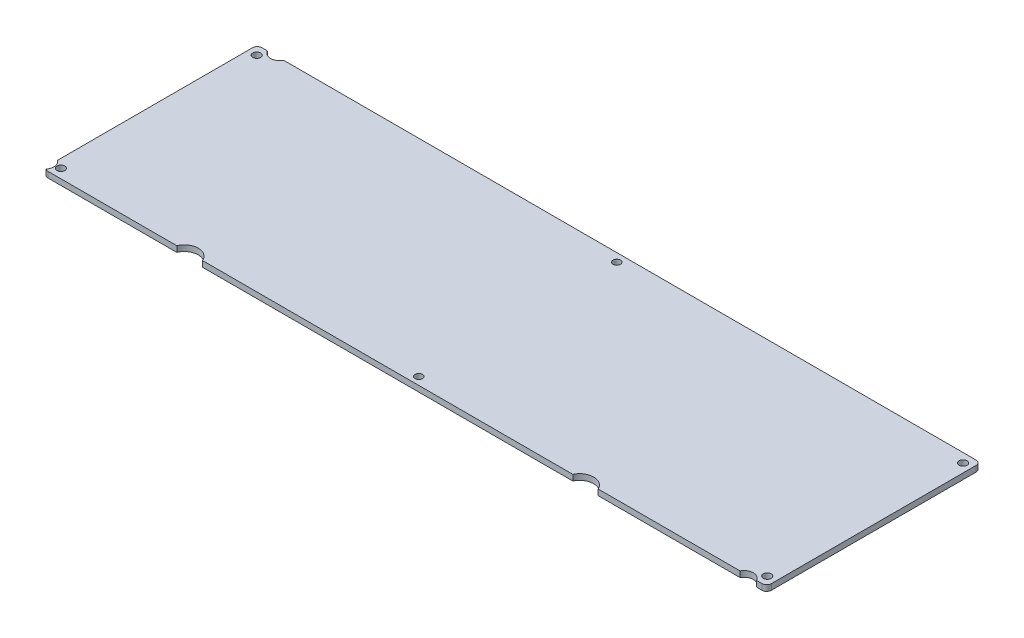
ISO-10303-21;
HEADER;
FILE_DESCRIPTION(('STEP AP214'),'2;1');
FILE_NAME('part.step','',(''),(''),'','','');
FILE_SCHEMA(('AUTOMOTIVE_DESIGN { 1 0 10303 214 1 1 1 1 }'));
ENDSEC;
DATA;
#1=APPLICATION_CONTEXT('core data for automotive mechanical design processes');
#2=APPLICATION_PROTOCOL_DEFINITION('international standard','automotive_design',2000,#1);
#3=PRODUCT_CONTEXT('',#1,'mechanical');
#4=PRODUCT('Part','Part','',(#3));
#5=PRODUCT_RELATED_PRODUCT_CATEGORY('part','',(#4));
#6=PRODUCT_DEFINITION_FORMATION('','',#4);
#7=PRODUCT_DEFINITION_CONTEXT('part definition',#1,'design');
#8=PRODUCT_DEFINITION('design','',#6,#7);
#9=PRODUCT_DEFINITION_SHAPE('','',#8);
#10=(LENGTH_UNIT() NAMED_UNIT(*) SI_UNIT(.MILLI.,.METRE.));
#11=(NAMED_UNIT(*) PLANE_ANGLE_UNIT() SI_UNIT($,.RADIAN.));
#12=(NAMED_UNIT(*) SI_UNIT($,.STERADIAN.) SOLID_ANGLE_UNIT());
#13=UNCERTAINTY_MEASURE_WITH_UNIT(LENGTH_MEASURE(1.E-05),#10,'distance_accuracy_value','');
#14=(GEOMETRIC_REPRESENTATION_CONTEXT(3) GLOBAL_UNCERTAINTY_ASSIGNED_CONTEXT((#13)) GLOBAL_UNIT_ASSIGNED_CONTEXT((#10,
#11,#12)) REPRESENTATION_CONTEXT('',''));
#15=CARTESIAN_POINT('',(0.,0.,0.));
#16=DIRECTION('',(0.,0.,1.));
#17=DIRECTION('',(1.,0.,0.));
#18=AXIS2_PLACEMENT_3D('',#15,#16,#17);
#19=CARTESIAN_POINT('',(0.,2.5,0.));
#20=DIRECTION('',(0.,0.,-1.));
#21=DIRECTION('',(-1.,0.,0.));
#22=AXIS2_PLACEMENT_3D('',#19,#20,#21);
#23=PLANE('',#22);
#24=DIRECTION('',(1.,0.,0.));
#25=VECTOR('',#24,1.);
#26=CARTESIAN_POINT('',(0.,0.,0.));
#27=LINE('',#26,#25);
#28=CARTESIAN_POINT('',(68.4803896985448,0.,0.));
#29=VERTEX_POINT('',#28);
#30=CARTESIAN_POINT('',(227.670515161693,0.,0.));
#31=VERTEX_POINT('',#30);
#32=EDGE_CURVE('E205',#29,#31,#27,.T.);
#33=ORIENTED_EDGE('',*,*,#32,.T.);
#34=DIRECTION('',(0.,1.,0.));
#35=VECTOR('',#34,1.);
#36=CARTESIAN_POINT('',(227.670515161693,0.,0.));
#37=LINE('',#36,#35);
#38=CARTESIAN_POINT('',(227.670515161693,2.5,0.));
#39=VERTEX_POINT('',#38);
#40=EDGE_CURVE('E11',#31,#39,#37,.T.);
#41=ORIENTED_EDGE('',*,*,#40,.T.);
#42=DIRECTION('',(1.,0.,0.));
#43=VECTOR('',#42,1.);
#44=CARTESIAN_POINT('',(0.,2.5,0.));
#45=LINE('',#44,#43);
#46=CARTESIAN_POINT('',(68.4803896985448,2.5,0.));
#47=VERTEX_POINT('',#46);
#48=EDGE_CURVE('E170',#47,#39,#45,.T.);
#49=ORIENTED_EDGE('',*,*,#48,.F.);
#50=DIRECTION('',(0.,1.,0.));
#51=VECTOR('',#50,1.);
#52=CARTESIAN_POINT('',(68.4803896985448,0.,0.));
#53=LINE('',#52,#51);
#54=EDGE_CURVE('E152',#47,#29,#53,.F.);
#55=ORIENTED_EDGE('',*,*,#54,.T.);
#56=EDGE_LOOP('',(#33,#41,#49,#55));
#57=FACE_BOUND('',#56,.T.);
#58=ADVANCED_FACE('F36',(#57),#23,.F.);
#59=CARTESIAN_POINT('',(2.,0.,0.));
#60=VERTEX_POINT('',#59);
#61=CARTESIAN_POINT('',(57.4042839011235,0.,0.));
#62=VERTEX_POINT('',#61);
#63=EDGE_CURVE('E201',#60,#62,#27,.T.);
#64=ORIENTED_EDGE('',*,*,#63,.T.);
#65=DIRECTION('',(0.,1.,0.));
#66=VECTOR('',#65,1.);
#67=CARTESIAN_POINT('',(57.4042839011235,0.,0.));
#68=LINE('',#67,#66);
#69=CARTESIAN_POINT('',(57.4042839011235,2.5,0.));
#70=VERTEX_POINT('',#69);
#71=EDGE_CURVE('E161',#62,#70,#68,.T.);
#72=ORIENTED_EDGE('',*,*,#71,.T.);
#73=CARTESIAN_POINT('',(2.,2.5,0.));
#74=VERTEX_POINT('',#73);
#75=EDGE_CURVE('E172',#74,#70,#45,.T.);
#76=ORIENTED_EDGE('',*,*,#75,.F.);
#77=DIRECTION('',(0.,-1.,0.));
#78=VECTOR('',#77,1.);
#79=CARTESIAN_POINT('',(2.,2.5,0.));
#80=LINE('',#79,#78);
#81=EDGE_CURVE('E258',#74,#60,#80,.T.);
#82=ORIENTED_EDGE('',*,*,#81,.T.);
#83=EDGE_LOOP('',(#64,#72,#76,#82));
#84=FACE_BOUND('',#83,.T.);
#85=ADVANCED_FACE('F281',(#84),#23,.F.);
#86=CARTESIAN_POINT('',(303.08,2.5,1.84499999999999));
#87=DIRECTION('',(0.,1.,0.));
#88=DIRECTION('',(0.,0.,1.));
#89=AXIS2_PLACEMENT_3D('',#86,#87,#88);
#90=PLANE('',#89);
#91=CARTESIAN_POINT('',(233.122222663393,2.5,2.50577040366954));
#92=DIRECTION('',(0.,1.,0.));
#93=DIRECTION('',(0.,0.,1.));
#94=AXIS2_PLACEMENT_3D('',#91,#92,#93);
#95=CIRCLE('',#94,6.00000000000002);
#96=CARTESIAN_POINT('',(238.573930165093,2.5,0.));
#97=VERTEX_POINT('',#96);
#98=EDGE_CURVE('E278',#97,#39,#95,.T.);
#99=ORIENTED_EDGE('',*,*,#98,.F.);
#100=CARTESIAN_POINT('',(299.530919133071,2.5,0.));
#101=VERTEX_POINT('',#100);
#102=EDGE_CURVE('E174',#97,#101,#45,.T.);
#103=ORIENTED_EDGE('',*,*,#102,.T.);
#104=CARTESIAN_POINT('',(303.08,2.5,1.84499999999999));
#105=DIRECTION('',(0.,-1.,0.));
#106=DIRECTION('',(0.,0.,1.));
#107=AXIS2_PLACEMENT_3D('',#104,#105,#106);
#108=CIRCLE('',#107,4.);
#109=CARTESIAN_POINT('',(306.629080866929,2.5,0.));
#110=VERTEX_POINT('',#109);
#111=EDGE_CURVE('E176',#101,#110,#108,.T.);
#112=ORIENTED_EDGE('',*,*,#111,.T.);
#113=DIRECTION('',(1.,0.,0.));
#114=VECTOR('',#113,1.);
#115=CARTESIAN_POINT('',(306.629080866929,2.5,0.));
#116=LINE('',#115,#114);
#117=CARTESIAN_POINT('',(309.,2.5,0.));
#118=VERTEX_POINT('',#117);
#119=EDGE_CURVE('E182',#110,#118,#116,.T.);
#120=ORIENTED_EDGE('',*,*,#119,.T.);
#121=CARTESIAN_POINT('',(309.,2.5,-2.00000000000002));
#122=DIRECTION('',(0.,1.,0.));
#123=DIRECTION('',(0.,0.,1.));
#124=AXIS2_PLACEMENT_3D('',#121,#122,#123);
#125=CIRCLE('',#124,2.);
#126=CARTESIAN_POINT('',(311.,2.5,-2.00000000000002));
#127=VERTEX_POINT('',#126);
#128=EDGE_CURVE('E253',#118,#127,#125,.T.);
#129=ORIENTED_EDGE('',*,*,#128,.T.);
#130=DIRECTION('',(0.,0.,-1.));
#131=VECTOR('',#130,1.);
#132=CARTESIAN_POINT('',(311.,2.5,-92.));
#133=LINE('',#132,#131);
#134=CARTESIAN_POINT('',(311.,2.5,-90.));
#135=VERTEX_POINT('',#134);
#136=EDGE_CURVE('E185',#127,#135,#133,.T.);
#137=ORIENTED_EDGE('',*,*,#136,.T.);
#138=CARTESIAN_POINT('',(309.,2.5,-90.));
#139=DIRECTION('',(0.,1.,0.));
#140=DIRECTION('',(0.,0.,1.));
#141=AXIS2_PLACEMENT_3D('',#138,#139,#140);
#142=CIRCLE('',#141,2.);
#143=CARTESIAN_POINT('',(309.,2.5,-92.));
#144=VERTEX_POINT('',#143);
#145=EDGE_CURVE('E251',#135,#144,#142,.T.);
#146=ORIENTED_EDGE('',*,*,#145,.T.);
#147=DIRECTION('',(-1.,0.,0.));
#148=VECTOR('',#147,1.);
#149=CARTESIAN_POINT('',(11.4690808669288,2.5,-92.));
#150=LINE('',#149,#148);
#151=CARTESIAN_POINT('',(11.4690808669288,2.5,-92.));
#152=VERTEX_POINT('',#151);
#153=EDGE_CURVE('E188',#144,#152,#150,.T.);
#154=ORIENTED_EDGE('',*,*,#153,.T.);
#155=CARTESIAN_POINT('',(7.92000000000005,2.5,-93.845));
#156=DIRECTION('',(0.,-1.,0.));
#157=DIRECTION('',(0.,0.,1.));
#158=AXIS2_PLACEMENT_3D('',#155,#156,#157);
#159=CIRCLE('',#158,4.);
#160=CARTESIAN_POINT('',(4.37091913307127,2.5,-92.));
#161=VERTEX_POINT('',#160);
#162=EDGE_CURVE('E190',#152,#161,#159,.T.);
#163=ORIENTED_EDGE('',*,*,#162,.T.);
#164=DIRECTION('',(-1.,0.,0.));
#165=VECTOR('',#164,1.);
#166=CARTESIAN_POINT('',(0.,2.5,-92.));
#167=LINE('',#166,#165);
#168=CARTESIAN_POINT('',(2.,2.5,-92.));
#169=VERTEX_POINT('',#168);
#170=EDGE_CURVE('E192',#161,#169,#167,.T.);
#171=ORIENTED_EDGE('',*,*,#170,.T.);
#172=CARTESIAN_POINT('',(1.99999999999999,2.5,-90.));
#173=DIRECTION('',(0.,1.,0.));
#174=DIRECTION('',(0.,0.,1.));
#175=AXIS2_PLACEMENT_3D('',#172,#173,#174);
#176=CIRCLE('',#175,2.);
#177=CARTESIAN_POINT('',(0.,2.5,-90.));
#178=VERTEX_POINT('',#177);
#179=EDGE_CURVE('E247',#169,#178,#176,.T.);
#180=ORIENTED_EDGE('',*,*,#179,.T.);
#181=DIRECTION('',(0.,0.,1.));
#182=VECTOR('',#181,1.);
#183=CARTESIAN_POINT('',(0.,2.5,-92.));
#184=LINE('',#183,#182);
#185=CARTESIAN_POINT('',(0.,2.5,-6.16346589670663));
#186=VERTEX_POINT('',#185);
#187=EDGE_CURVE('E177',#178,#186,#184,.T.);
#188=ORIENTED_EDGE('',*,*,#187,.T.);
#189=CARTESIAN_POINT('',(-2.31999999999996,2.5,-2.905));
#190=DIRECTION('',(0.,1.,0.));
#191=DIRECTION('',(0.,0.,1.));
#192=AXIS2_PLACEMENT_3D('',#189,#190,#191);
#193=CIRCLE('',#192,4.);
#194=CARTESIAN_POINT('',(0.799057342904189,2.5,-0.400707426901614));
#195=VERTEX_POINT('',#194);
#196=EDGE_CURVE('E292',#195,#186,#193,.T.);
#197=ORIENTED_EDGE('',*,*,#196,.F.);
#198=CARTESIAN_POINT('',(2.,2.5,-2.));
#199=DIRECTION('',(0.,1.,0.));
#200=DIRECTION('',(0.,0.,1.));
#201=AXIS2_PLACEMENT_3D('',#198,#199,#200);
#202=CIRCLE('',#201,2.);
#203=EDGE_CURVE('E249',#195,#74,#202,.T.);
#204=ORIENTED_EDGE('',*,*,#203,.T.);
#205=ORIENTED_EDGE('',*,*,#75,.T.);
#206=CARTESIAN_POINT('',(62.9423367998341,2.5,2.30867279861884));
#207=DIRECTION('',(0.,1.,0.));
#208=DIRECTION('',(0.,0.,1.));
#209=AXIS2_PLACEMENT_3D('',#206,#207,#208);
#210=CIRCLE('',#209,6.);
#211=EDGE_CURVE('E155',#47,#70,#210,.T.);
#212=ORIENTED_EDGE('',*,*,#211,.F.);
#213=ORIENTED_EDGE('',*,*,#48,.T.);
#214=EDGE_LOOP('',(#99,#103,#112,#120,#129,#137,#146,#154,#163,#171,#180,#188,#197,#204,#205,
#212,#213));
#215=FACE_BOUND('',#214,.T.);
#216=CARTESIAN_POINT('',(158.14,2.5,-88.415));
#217=DIRECTION('',(0.,1.,0.));
#218=DIRECTION('',(0.,0.,1.));
#219=AXIS2_PLACEMENT_3D('',#216,#217,#218);
#220=CIRCLE('',#219,1.59999999999999);
#221=CARTESIAN_POINT('',(158.14,2.5,-86.815));
#222=VERTEX_POINT('',#221);
#223=EDGE_CURVE('E350',#222,#222,#220,.T.);
#224=ORIENTED_EDGE('',*,*,#223,.F.);
#225=EDGE_LOOP('',(#224));
#226=FACE_BOUND('',#225,.T.);
#227=CARTESIAN_POINT('',(3.68000000000004,2.5,-88.095));
#228=DIRECTION('',(0.,1.,0.));
#229=DIRECTION('',(0.,0.,1.));
#230=AXIS2_PLACEMENT_3D('',#227,#228,#229);
#231=CIRCLE('',#230,1.70000000000001);
#232=CARTESIAN_POINT('',(3.68000000000004,2.5,-86.395));
#233=VERTEX_POINT('',#232);
#234=EDGE_CURVE('E362',#233,#233,#231,.T.);
#235=ORIENTED_EDGE('',*,*,#234,.F.);
#236=EDGE_LOOP('',(#235));
#237=FACE_BOUND('',#236,.T.);
#238=CARTESIAN_POINT('',(307.32,2.5,-88.095));
#239=DIRECTION('',(0.,1.,0.));
#240=DIRECTION('',(0.,0.,1.));
#241=AXIS2_PLACEMENT_3D('',#238,#239,#240);
#242=CIRCLE('',#241,1.69999999999996);
#243=CARTESIAN_POINT('',(307.32,2.5,-86.3950000000001));
#244=VERTEX_POINT('',#243);
#245=EDGE_CURVE('E200',#244,#244,#242,.T.);
#246=ORIENTED_EDGE('',*,*,#245,.F.);
#247=EDGE_LOOP('',(#246));
#248=FACE_BOUND('',#247,.T.);
#249=CARTESIAN_POINT('',(307.32,2.5,-3.905));
#250=DIRECTION('',(0.,1.,0.));
#251=DIRECTION('',(0.,0.,1.));
#252=AXIS2_PLACEMENT_3D('',#249,#250,#251);
#253=CIRCLE('',#252,1.69999999999996);
#254=CARTESIAN_POINT('',(307.32,2.5,-2.20500000000004));
#255=VERTEX_POINT('',#254);
#256=EDGE_CURVE('E368',#255,#255,#253,.T.);
#257=ORIENTED_EDGE('',*,*,#256,.F.);
#258=EDGE_LOOP('',(#257));
#259=FACE_BOUND('',#258,.T.);
#260=CARTESIAN_POINT('',(3.68000000000004,2.5,-3.905));
#261=DIRECTION('',(0.,1.,0.));
#262=DIRECTION('',(0.,0.,1.));
#263=AXIS2_PLACEMENT_3D('',#260,#261,#262);
#264=CIRCLE('',#263,1.7);
#265=CARTESIAN_POINT('',(3.68000000000004,2.5,-2.205));
#266=VERTEX_POINT('',#265);
#267=EDGE_CURVE('E356',#266,#266,#264,.T.);
#268=ORIENTED_EDGE('',*,*,#267,.F.);
#269=EDGE_LOOP('',(#268));
#270=FACE_BOUND('',#269,.T.);
#271=CARTESIAN_POINT('',(158.14,2.5,-3.315));
#272=DIRECTION('',(0.,1.,0.));
#273=DIRECTION('',(0.,0.,1.));
#274=AXIS2_PLACEMENT_3D('',#271,#272,#273);
#275=CIRCLE('',#274,1.59999999999999);
#276=CARTESIAN_POINT('',(158.14,2.5,-1.715));
#277=VERTEX_POINT('',#276);
#278=EDGE_CURVE('E344',#277,#277,#275,.T.);
#279=ORIENTED_EDGE('',*,*,#278,.F.);
#280=EDGE_LOOP('',(#279));
#281=FACE_BOUND('',#280,.T.);
#282=ADVANCED_FACE('F168',(#215,#226,#237,#248,#259,#270,#281),#90,.T.);
#283=CARTESIAN_POINT('',(303.08,0.,1.84499999999999));
#284=DIRECTION('',(0.,1.,0.));
#285=DIRECTION('',(0.,0.,1.));
#286=AXIS2_PLACEMENT_3D('',#283,#284,#285);
#287=PLANE('',#286);
#288=CARTESIAN_POINT('',(238.573930165093,0.,0.));
#289=VERTEX_POINT('',#288);
#290=CARTESIAN_POINT('',(299.530919133071,0.,0.));
#291=VERTEX_POINT('',#290);
#292=EDGE_CURVE('E199',#289,#291,#27,.T.);
#293=ORIENTED_EDGE('',*,*,#292,.F.);
#294=CARTESIAN_POINT('',(233.122222663393,0.,2.50577040366954));
#295=DIRECTION('',(0.,1.,0.));
#296=DIRECTION('',(0.,0.,1.));
#297=AXIS2_PLACEMENT_3D('',#294,#295,#296);
#298=CIRCLE('',#297,6.00000000000002);
#299=EDGE_CURVE('E51',#289,#31,#298,.T.);
#300=ORIENTED_EDGE('',*,*,#299,.T.);
#301=ORIENTED_EDGE('',*,*,#32,.F.);
#302=CARTESIAN_POINT('',(62.9423367998341,0.,2.30867279861884));
#303=DIRECTION('',(0.,1.,0.));
#304=DIRECTION('',(0.,0.,1.));
#305=AXIS2_PLACEMENT_3D('',#302,#303,#304);
#306=CIRCLE('',#305,6.);
#307=EDGE_CURVE('E59',#29,#62,#306,.T.);
#308=ORIENTED_EDGE('',*,*,#307,.T.);
#309=ORIENTED_EDGE('',*,*,#63,.F.);
#310=CARTESIAN_POINT('',(2.,0.,-2.));
#311=DIRECTION('',(0.,1.,0.));
#312=DIRECTION('',(0.,0.,1.));
#313=AXIS2_PLACEMENT_3D('',#310,#311,#312);
#314=CIRCLE('',#313,2.);
#315=CARTESIAN_POINT('',(0.799057342904189,0.,-0.400707426901615));
#316=VERTEX_POINT('',#315);
#317=EDGE_CURVE('E238',#60,#316,#314,.F.);
#318=ORIENTED_EDGE('',*,*,#317,.T.);
#319=CARTESIAN_POINT('',(-2.31999999999996,0.,-2.905));
#320=DIRECTION('',(0.,1.,0.));
#321=DIRECTION('',(0.,0.,1.));
#322=AXIS2_PLACEMENT_3D('',#319,#320,#321);
#323=CIRCLE('',#322,4.);
#324=CARTESIAN_POINT('',(0.,0.,-6.16346589670663));
#325=VERTEX_POINT('',#324);
#326=EDGE_CURVE('E289',#316,#325,#323,.T.);
#327=ORIENTED_EDGE('',*,*,#326,.T.);
#328=DIRECTION('',(0.,0.,1.));
#329=VECTOR('',#328,1.);
#330=CARTESIAN_POINT('',(0.,0.,-92.));
#331=LINE('',#330,#329);
#332=CARTESIAN_POINT('',(0.,0.,-90.));
#333=VERTEX_POINT('',#332);
#334=EDGE_CURVE('E196',#333,#325,#331,.T.);
#335=ORIENTED_EDGE('',*,*,#334,.F.);
#336=CARTESIAN_POINT('',(1.99999999999999,0.,-90.));
#337=DIRECTION('',(0.,1.,0.));
#338=DIRECTION('',(0.,0.,1.));
#339=AXIS2_PLACEMENT_3D('',#336,#337,#338);
#340=CIRCLE('',#339,2.);
#341=CARTESIAN_POINT('',(2.,0.,-92.));
#342=VERTEX_POINT('',#341);
#343=EDGE_CURVE('E236',#333,#342,#340,.F.);
#344=ORIENTED_EDGE('',*,*,#343,.T.);
#345=DIRECTION('',(-1.,0.,0.));
#346=VECTOR('',#345,1.);
#347=CARTESIAN_POINT('',(0.,0.,-92.));
#348=LINE('',#347,#346);
#349=CARTESIAN_POINT('',(4.37091913307127,0.,-92.));
#350=VERTEX_POINT('',#349);
#351=EDGE_CURVE('E217',#350,#342,#348,.T.);
#352=ORIENTED_EDGE('',*,*,#351,.F.);
#353=CARTESIAN_POINT('',(7.92000000000005,0.,-93.845));
#354=DIRECTION('',(0.,-1.,0.));
#355=DIRECTION('',(0.,0.,1.));
#356=AXIS2_PLACEMENT_3D('',#353,#354,#355);
#357=CIRCLE('',#356,4.);
#358=CARTESIAN_POINT('',(11.4690808669288,0.,-92.));
#359=VERTEX_POINT('',#358);
#360=EDGE_CURVE('E215',#359,#350,#357,.T.);
#361=ORIENTED_EDGE('',*,*,#360,.F.);
#362=DIRECTION('',(-1.,0.,0.));
#363=VECTOR('',#362,1.);
#364=CARTESIAN_POINT('',(11.4690808669288,0.,-92.));
#365=LINE('',#364,#363);
#366=CARTESIAN_POINT('',(309.,0.,-92.));
#367=VERTEX_POINT('',#366);
#368=EDGE_CURVE('E213',#367,#359,#365,.T.);
#369=ORIENTED_EDGE('',*,*,#368,.F.);
#370=CARTESIAN_POINT('',(309.,0.,-90.));
#371=DIRECTION('',(0.,1.,0.));
#372=DIRECTION('',(0.,0.,1.));
#373=AXIS2_PLACEMENT_3D('',#370,#371,#372);
#374=CIRCLE('',#373,2.);
#375=CARTESIAN_POINT('',(311.,0.,-90.));
#376=VERTEX_POINT('',#375);
#377=EDGE_CURVE('E241',#367,#376,#374,.F.);
#378=ORIENTED_EDGE('',*,*,#377,.T.);
#379=DIRECTION('',(0.,0.,-1.));
#380=VECTOR('',#379,1.);
#381=CARTESIAN_POINT('',(311.,0.,-92.));
#382=LINE('',#381,#380);
#383=CARTESIAN_POINT('',(311.,0.,-2.00000000000002));
#384=VERTEX_POINT('',#383);
#385=EDGE_CURVE('E210',#384,#376,#382,.T.);
#386=ORIENTED_EDGE('',*,*,#385,.F.);
#387=CARTESIAN_POINT('',(309.,0.,-2.00000000000002));
#388=DIRECTION('',(0.,1.,0.));
#389=DIRECTION('',(0.,0.,1.));
#390=AXIS2_PLACEMENT_3D('',#387,#388,#389);
#391=CIRCLE('',#390,2.);
#392=CARTESIAN_POINT('',(309.,0.,0.));
#393=VERTEX_POINT('',#392);
#394=EDGE_CURVE('E243',#384,#393,#391,.F.);
#395=ORIENTED_EDGE('',*,*,#394,.T.);
#396=DIRECTION('',(1.,0.,0.));
#397=VECTOR('',#396,1.);
#398=CARTESIAN_POINT('',(306.629080866929,0.,0.));
#399=LINE('',#398,#397);
#400=CARTESIAN_POINT('',(306.629080866929,0.,0.));
#401=VERTEX_POINT('',#400);
#402=EDGE_CURVE('E207',#401,#393,#399,.T.);
#403=ORIENTED_EDGE('',*,*,#402,.F.);
#404=CARTESIAN_POINT('',(303.08,0.,1.84499999999999));
#405=DIRECTION('',(0.,-1.,0.));
#406=DIRECTION('',(0.,0.,1.));
#407=AXIS2_PLACEMENT_3D('',#404,#405,#406);
#408=CIRCLE('',#407,4.);
#409=EDGE_CURVE('E204',#291,#401,#408,.T.);
#410=ORIENTED_EDGE('',*,*,#409,.F.);
#411=EDGE_LOOP('',(#293,#300,#301,#308,#309,#318,#327,#335,#344,#352,#361,#369,#378,#386,#395,
#403,#410));
#412=FACE_BOUND('',#411,.T.);
#413=CARTESIAN_POINT('',(307.32,0.,-88.095));
#414=DIRECTION('',(0.,1.,0.));
#415=DIRECTION('',(0.,0.,1.));
#416=AXIS2_PLACEMENT_3D('',#413,#414,#415);
#417=CIRCLE('',#416,1.69999999999996);
#418=CARTESIAN_POINT('',(307.32,0.,-86.3950000000001));
#419=VERTEX_POINT('',#418);
#420=EDGE_CURVE('E371',#419,#419,#417,.T.);
#421=ORIENTED_EDGE('',*,*,#420,.T.);
#422=EDGE_LOOP('',(#421));
#423=FACE_BOUND('',#422,.T.);
#424=CARTESIAN_POINT('',(307.32,0.,-3.905));
#425=DIRECTION('',(0.,1.,0.));
#426=DIRECTION('',(0.,0.,1.));
#427=AXIS2_PLACEMENT_3D('',#424,#425,#426);
#428=CIRCLE('',#427,1.69999999999996);
#429=CARTESIAN_POINT('',(307.32,0.,-2.20500000000004));
#430=VERTEX_POINT('',#429);
#431=EDGE_CURVE('E365',#430,#430,#428,.T.);
#432=ORIENTED_EDGE('',*,*,#431,.T.);
#433=EDGE_LOOP('',(#432));
#434=FACE_BOUND('',#433,.T.);
#435=CARTESIAN_POINT('',(3.68000000000004,0.,-88.095));
#436=DIRECTION('',(0.,1.,0.));
#437=DIRECTION('',(0.,0.,1.));
#438=AXIS2_PLACEMENT_3D('',#435,#436,#437);
#439=CIRCLE('',#438,1.70000000000001);
#440=CARTESIAN_POINT('',(3.68000000000004,0.,-86.395));
#441=VERTEX_POINT('',#440);
#442=EDGE_CURVE('E359',#441,#441,#439,.T.);
#443=ORIENTED_EDGE('',*,*,#442,.T.);
#444=EDGE_LOOP('',(#443));
#445=FACE_BOUND('',#444,.T.);
#446=CARTESIAN_POINT('',(3.68000000000004,0.,-3.905));
#447=DIRECTION('',(0.,1.,0.));
#448=DIRECTION('',(0.,0.,1.));
#449=AXIS2_PLACEMENT_3D('',#446,#447,#448);
#450=CIRCLE('',#449,1.7);
#451=CARTESIAN_POINT('',(3.68000000000004,0.,-2.205));
#452=VERTEX_POINT('',#451);
#453=EDGE_CURVE('E353',#452,#452,#450,.T.);
#454=ORIENTED_EDGE('',*,*,#453,.T.);
#455=EDGE_LOOP('',(#454));
#456=FACE_BOUND('',#455,.T.);
#457=CARTESIAN_POINT('',(158.14,0.,-88.415));
#458=DIRECTION('',(0.,1.,0.));
#459=DIRECTION('',(0.,0.,1.));
#460=AXIS2_PLACEMENT_3D('',#457,#458,#459);
#461=CIRCLE('',#460,1.59999999999999);
#462=CARTESIAN_POINT('',(158.14,0.,-86.815));
#463=VERTEX_POINT('',#462);
#464=EDGE_CURVE('E347',#463,#463,#461,.T.);
#465=ORIENTED_EDGE('',*,*,#464,.T.);
#466=EDGE_LOOP('',(#465));
#467=FACE_BOUND('',#466,.T.);
#468=CARTESIAN_POINT('',(158.14,0.,-3.315));
#469=DIRECTION('',(0.,1.,0.));
#470=DIRECTION('',(0.,0.,1.));
#471=AXIS2_PLACEMENT_3D('',#468,#469,#470);
#472=CIRCLE('',#471,1.59999999999999);
#473=CARTESIAN_POINT('',(158.14,0.,-1.715));
#474=VERTEX_POINT('',#473);
#475=EDGE_CURVE('E343',#474,#474,#472,.T.);
#476=ORIENTED_EDGE('',*,*,#475,.T.);
#477=EDGE_LOOP('',(#476));
#478=FACE_BOUND('',#477,.T.);
#479=ADVANCED_FACE('F274',(#412,#423,#434,#445,#456,#467,#478),#287,.F.);
#480=CARTESIAN_POINT('',(0.,2.5,-92.));
#481=DIRECTION('',(1.,0.,0.));
#482=DIRECTION('',(0.,0.,-1.));
#483=AXIS2_PLACEMENT_3D('',#480,#481,#482);
#484=PLANE('',#483);
#485=ORIENTED_EDGE('',*,*,#334,.T.);
#486=DIRECTION('',(0.,1.,0.));
#487=VECTOR('',#486,1.);
#488=CARTESIAN_POINT('',(0.,0.,-6.16346589670663));
#489=LINE('',#488,#487);
#490=EDGE_CURVE('E291',#325,#186,#489,.T.);
#491=ORIENTED_EDGE('',*,*,#490,.T.);
#492=ORIENTED_EDGE('',*,*,#187,.F.);
#493=DIRECTION('',(0.,-1.,0.));
#494=VECTOR('',#493,1.);
#495=CARTESIAN_POINT('',(0.,2.5,-90.));
#496=LINE('',#495,#494);
#497=EDGE_CURVE('E261',#178,#333,#496,.T.);
#498=ORIENTED_EDGE('',*,*,#497,.T.);
#499=EDGE_LOOP('',(#485,#491,#492,#498));
#500=FACE_BOUND('',#499,.T.);
#501=ADVANCED_FACE('F296',(#500),#484,.F.);
#502=ORIENTED_EDGE('',*,*,#102,.F.);
#503=DIRECTION('',(0.,1.,0.));
#504=VECTOR('',#503,1.);
#505=CARTESIAN_POINT('',(238.573930165093,0.,0.));
#506=LINE('',#505,#504);
#507=EDGE_CURVE('E44',#97,#289,#506,.F.);
#508=ORIENTED_EDGE('',*,*,#507,.T.);
#509=ORIENTED_EDGE('',*,*,#292,.T.);
#510=DIRECTION('',(0.,-1.,0.));
#511=VECTOR('',#510,1.);
#512=CARTESIAN_POINT('',(299.530919133071,2.5,0.));
#513=LINE('',#512,#511);
#514=EDGE_CURVE('E228',#101,#291,#513,.T.);
#515=ORIENTED_EDGE('',*,*,#514,.F.);
#516=EDGE_LOOP('',(#502,#508,#509,#515));
#517=FACE_BOUND('',#516,.T.);
#518=ADVANCED_FACE('F270',(#517),#23,.F.);
#519=CARTESIAN_POINT('',(303.08,2.5,1.84499999999999));
#520=DIRECTION('',(0.,-1.,0.));
#521=DIRECTION('',(0.,0.,-1.));
#522=AXIS2_PLACEMENT_3D('',#519,#520,#521);
#523=CYLINDRICAL_SURFACE('',#522,4.);
#524=ORIENTED_EDGE('',*,*,#409,.T.);
#525=DIRECTION('',(0.,-1.,0.));
#526=VECTOR('',#525,1.);
#527=CARTESIAN_POINT('',(306.629080866929,2.5,0.));
#528=LINE('',#527,#526);
#529=EDGE_CURVE('E225',#110,#401,#528,.T.);
#530=ORIENTED_EDGE('',*,*,#529,.F.);
#531=ORIENTED_EDGE('',*,*,#111,.F.);
#532=ORIENTED_EDGE('',*,*,#514,.T.);
#533=EDGE_LOOP('',(#524,#530,#531,#532));
#534=FACE_BOUND('',#533,.T.);
#535=ADVANCED_FACE('F337',(#534),#523,.F.);
#536=CARTESIAN_POINT('',(306.629080866929,2.5,0.));
#537=DIRECTION('',(0.,0.,-1.));
#538=DIRECTION('',(-1.,0.,0.));
#539=AXIS2_PLACEMENT_3D('',#536,#537,#538);
#540=PLANE('',#539);
#541=ORIENTED_EDGE('',*,*,#402,.T.);
#542=DIRECTION('',(0.,-1.,0.));
#543=VECTOR('',#542,1.);
#544=CARTESIAN_POINT('',(309.,2.5,0.));
#545=LINE('',#544,#543);
#546=EDGE_CURVE('E245',#393,#118,#545,.F.);
#547=ORIENTED_EDGE('',*,*,#546,.T.);
#548=ORIENTED_EDGE('',*,*,#119,.F.);
#549=ORIENTED_EDGE('',*,*,#529,.T.);
#550=EDGE_LOOP('',(#541,#547,#548,#549));
#551=FACE_BOUND('',#550,.T.);
#552=ADVANCED_FACE('F333',(#551),#540,.F.);
#553=CARTESIAN_POINT('',(311.,2.5,-92.));
#554=DIRECTION('',(-1.,0.,0.));
#555=DIRECTION('',(0.,0.,1.));
#556=AXIS2_PLACEMENT_3D('',#553,#554,#555);
#557=PLANE('',#556);
#558=ORIENTED_EDGE('',*,*,#136,.F.);
#559=DIRECTION('',(0.,-1.,0.));
#560=VECTOR('',#559,1.);
#561=CARTESIAN_POINT('',(311.,2.5,-2.00000000000002));
#562=LINE('',#561,#560);
#563=EDGE_CURVE('E233',#127,#384,#562,.T.);
#564=ORIENTED_EDGE('',*,*,#563,.T.);
#565=ORIENTED_EDGE('',*,*,#385,.T.);
#566=DIRECTION('',(0.,-1.,0.));
#567=VECTOR('',#566,1.);
#568=CARTESIAN_POINT('',(311.,2.5,-90.));
#569=LINE('',#568,#567);
#570=EDGE_CURVE('E231',#376,#135,#569,.F.);
#571=ORIENTED_EDGE('',*,*,#570,.T.);
#572=EDGE_LOOP('',(#558,#564,#565,#571));
#573=FACE_BOUND('',#572,.T.);
#574=ADVANCED_FACE('F325',(#573),#557,.F.);
#575=CARTESIAN_POINT('',(11.4690808669288,2.5,-92.));
#576=DIRECTION('',(0.,0.,1.));
#577=DIRECTION('',(1.,0.,0.));
#578=AXIS2_PLACEMENT_3D('',#575,#576,#577);
#579=PLANE('',#578);
#580=ORIENTED_EDGE('',*,*,#153,.F.);
#581=DIRECTION('',(0.,-1.,0.));
#582=VECTOR('',#581,1.);
#583=CARTESIAN_POINT('',(309.,2.5,-92.));
#584=LINE('',#583,#582);
#585=EDGE_CURVE('E255',#144,#367,#584,.T.);
#586=ORIENTED_EDGE('',*,*,#585,.T.);
#587=ORIENTED_EDGE('',*,*,#368,.T.);
#588=DIRECTION('',(0.,-1.,0.));
#589=VECTOR('',#588,1.);
#590=CARTESIAN_POINT('',(11.4690808669288,2.5,-92.));
#591=LINE('',#590,#589);
#592=EDGE_CURVE('E222',#152,#359,#591,.T.);
#593=ORIENTED_EDGE('',*,*,#592,.F.);
#594=EDGE_LOOP('',(#580,#586,#587,#593));
#595=FACE_BOUND('',#594,.T.);
#596=ADVANCED_FACE('F317',(#595),#579,.F.);
#597=CARTESIAN_POINT('',(7.92000000000005,2.5,-93.845));
#598=DIRECTION('',(0.,-1.,0.));
#599=DIRECTION('',(0.,0.,-1.));
#600=AXIS2_PLACEMENT_3D('',#597,#598,#599);
#601=CYLINDRICAL_SURFACE('',#600,4.);
#602=ORIENTED_EDGE('',*,*,#360,.T.);
#603=DIRECTION('',(0.,-1.,0.));
#604=VECTOR('',#603,1.);
#605=CARTESIAN_POINT('',(4.37091913307127,2.5,-92.));
#606=LINE('',#605,#604);
#607=EDGE_CURVE('E195',#161,#350,#606,.T.);
#608=ORIENTED_EDGE('',*,*,#607,.F.);
#609=ORIENTED_EDGE('',*,*,#162,.F.);
#610=ORIENTED_EDGE('',*,*,#592,.T.);
#611=EDGE_LOOP('',(#602,#608,#609,#610));
#612=FACE_BOUND('',#611,.T.);
#613=ADVANCED_FACE('F311',(#612),#601,.F.);
#614=CARTESIAN_POINT('',(0.,2.5,-92.));
#615=DIRECTION('',(0.,0.,1.));
#616=DIRECTION('',(1.,0.,0.));
#617=AXIS2_PLACEMENT_3D('',#614,#615,#616);
#618=PLANE('',#617);
#619=ORIENTED_EDGE('',*,*,#351,.T.);
#620=DIRECTION('',(0.,-1.,0.));
#621=VECTOR('',#620,1.);
#622=CARTESIAN_POINT('',(2.,2.5,-92.));
#623=LINE('',#622,#621);
#624=EDGE_CURVE('E264',#342,#169,#623,.F.);
#625=ORIENTED_EDGE('',*,*,#624,.T.);
#626=ORIENTED_EDGE('',*,*,#170,.F.);
#627=ORIENTED_EDGE('',*,*,#607,.T.);
#628=EDGE_LOOP('',(#619,#625,#626,#627));
#629=FACE_BOUND('',#628,.T.);
#630=ADVANCED_FACE('F306',(#629),#618,.F.);
#631=CARTESIAN_POINT('',(307.32,2.5,-88.095));
#632=DIRECTION('',(0.,-1.,0.));
#633=DIRECTION('',(0.,0.,-1.));
#634=AXIS2_PLACEMENT_3D('',#631,#632,#633);
#635=CYLINDRICAL_SURFACE('',#634,1.69999999999996);
#636=ORIENTED_EDGE('',*,*,#245,.T.);
#637=EDGE_LOOP('',(#636));
#638=FACE_BOUND('',#637,.T.);
#639=ORIENTED_EDGE('',*,*,#420,.F.);
#640=EDGE_LOOP('',(#639));
#641=FACE_BOUND('',#640,.T.);
#642=ADVANCED_FACE('F379',(#638,#641),#635,.F.);
#643=CARTESIAN_POINT('',(307.32,2.5,-3.905));
#644=DIRECTION('',(0.,-1.,0.));
#645=DIRECTION('',(0.,0.,-1.));
#646=AXIS2_PLACEMENT_3D('',#643,#644,#645);
#647=CYLINDRICAL_SURFACE('',#646,1.69999999999996);
#648=ORIENTED_EDGE('',*,*,#256,.T.);
#649=EDGE_LOOP('',(#648));
#650=FACE_BOUND('',#649,.T.);
#651=ORIENTED_EDGE('',*,*,#431,.F.);
#652=EDGE_LOOP('',(#651));
#653=FACE_BOUND('',#652,.T.);
#654=ADVANCED_FACE('F381',(#650,#653),#647,.F.);
#655=CARTESIAN_POINT('',(3.68000000000004,2.5,-88.095));
#656=DIRECTION('',(0.,-1.,0.));
#657=DIRECTION('',(0.,0.,-1.));
#658=AXIS2_PLACEMENT_3D('',#655,#656,#657);
#659=CYLINDRICAL_SURFACE('',#658,1.70000000000001);
#660=ORIENTED_EDGE('',*,*,#234,.T.);
#661=EDGE_LOOP('',(#660));
#662=FACE_BOUND('',#661,.T.);
#663=ORIENTED_EDGE('',*,*,#442,.F.);
#664=EDGE_LOOP('',(#663));
#665=FACE_BOUND('',#664,.T.);
#666=ADVANCED_FACE('F388',(#662,#665),#659,.F.);
#667=CARTESIAN_POINT('',(3.68000000000004,2.5,-3.905));
#668=DIRECTION('',(0.,-1.,0.));
#669=DIRECTION('',(0.,0.,-1.));
#670=AXIS2_PLACEMENT_3D('',#667,#668,#669);
#671=CYLINDRICAL_SURFACE('',#670,1.7);
#672=ORIENTED_EDGE('',*,*,#267,.T.);
#673=EDGE_LOOP('',(#672));
#674=FACE_BOUND('',#673,.T.);
#675=ORIENTED_EDGE('',*,*,#453,.F.);
#676=EDGE_LOOP('',(#675));
#677=FACE_BOUND('',#676,.T.);
#678=ADVANCED_FACE('F436',(#674,#677),#671,.F.);
#679=CARTESIAN_POINT('',(158.14,2.5,-88.415));
#680=DIRECTION('',(0.,-1.,0.));
#681=DIRECTION('',(0.,0.,-1.));
#682=AXIS2_PLACEMENT_3D('',#679,#680,#681);
#683=CYLINDRICAL_SURFACE('',#682,1.59999999999999);
#684=ORIENTED_EDGE('',*,*,#223,.T.);
#685=EDGE_LOOP('',(#684));
#686=FACE_BOUND('',#685,.T.);
#687=ORIENTED_EDGE('',*,*,#464,.F.);
#688=EDGE_LOOP('',(#687));
#689=FACE_BOUND('',#688,.T.);
#690=ADVANCED_FACE('F432',(#686,#689),#683,.F.);
#691=CARTESIAN_POINT('',(158.14,2.5,-3.315));
#692=DIRECTION('',(0.,-1.,0.));
#693=DIRECTION('',(0.,0.,-1.));
#694=AXIS2_PLACEMENT_3D('',#691,#692,#693);
#695=CYLINDRICAL_SURFACE('',#694,1.59999999999999);
#696=ORIENTED_EDGE('',*,*,#278,.T.);
#697=EDGE_LOOP('',(#696));
#698=FACE_BOUND('',#697,.T.);
#699=ORIENTED_EDGE('',*,*,#475,.F.);
#700=EDGE_LOOP('',(#699));
#701=FACE_BOUND('',#700,.T.);
#702=ADVANCED_FACE('F412',(#698,#701),#695,.F.);
#703=CARTESIAN_POINT('',(309.,2.5,-2.00000000000002));
#704=DIRECTION('',(0.,-1.,0.));
#705=DIRECTION('',(0.,0.,-1.));
#706=AXIS2_PLACEMENT_3D('',#703,#704,#705);
#707=CYLINDRICAL_SURFACE('',#706,2.);
#708=ORIENTED_EDGE('',*,*,#128,.F.);
#709=ORIENTED_EDGE('',*,*,#546,.F.);
#710=ORIENTED_EDGE('',*,*,#394,.F.);
#711=ORIENTED_EDGE('',*,*,#563,.F.);
#712=EDGE_LOOP('',(#708,#709,#710,#711));
#713=FACE_BOUND('',#712,.T.);
#714=ADVANCED_FACE('F331',(#713),#707,.T.);
#715=CARTESIAN_POINT('',(309.,2.5,-90.));
#716=DIRECTION('',(0.,-1.,0.));
#717=DIRECTION('',(0.,0.,-1.));
#718=AXIS2_PLACEMENT_3D('',#715,#716,#717);
#719=CYLINDRICAL_SURFACE('',#718,2.);
#720=ORIENTED_EDGE('',*,*,#145,.F.);
#721=ORIENTED_EDGE('',*,*,#570,.F.);
#722=ORIENTED_EDGE('',*,*,#377,.F.);
#723=ORIENTED_EDGE('',*,*,#585,.F.);
#724=EDGE_LOOP('',(#720,#721,#722,#723));
#725=FACE_BOUND('',#724,.T.);
#726=ADVANCED_FACE('F321',(#725),#719,.T.);
#727=CARTESIAN_POINT('',(2.,2.5,-2.));
#728=DIRECTION('',(0.,-1.,0.));
#729=DIRECTION('',(0.,0.,-1.));
#730=AXIS2_PLACEMENT_3D('',#727,#728,#729);
#731=CYLINDRICAL_SURFACE('',#730,2.);
#732=DIRECTION('',(0.,1.,0.));
#733=VECTOR('',#732,1.);
#734=CARTESIAN_POINT('',(0.79905734290419,1.25,-0.400707426901614));
#735=LINE('',#734,#733);
#736=EDGE_CURVE('E162',#316,#195,#735,.T.);
#737=ORIENTED_EDGE('',*,*,#736,.F.);
#738=ORIENTED_EDGE('',*,*,#317,.F.);
#739=ORIENTED_EDGE('',*,*,#81,.F.);
#740=ORIENTED_EDGE('',*,*,#203,.F.);
#741=EDGE_LOOP('',(#737,#738,#739,#740));
#742=FACE_BOUND('',#741,.T.);
#743=ADVANCED_FACE('F286',(#742),#731,.T.);
#744=CARTESIAN_POINT('',(1.99999999999999,2.5,-90.));
#745=DIRECTION('',(0.,-1.,0.));
#746=DIRECTION('',(0.,0.,-1.));
#747=AXIS2_PLACEMENT_3D('',#744,#745,#746);
#748=CYLINDRICAL_SURFACE('',#747,2.);
#749=ORIENTED_EDGE('',*,*,#179,.F.);
#750=ORIENTED_EDGE('',*,*,#624,.F.);
#751=ORIENTED_EDGE('',*,*,#343,.F.);
#752=ORIENTED_EDGE('',*,*,#497,.F.);
#753=EDGE_LOOP('',(#749,#750,#751,#752));
#754=FACE_BOUND('',#753,.T.);
#755=ADVANCED_FACE('F38',(#754),#748,.T.);
#756=CARTESIAN_POINT('',(-2.31999999999996,0.,-2.905));
#757=DIRECTION('',(0.,1.,0.));
#758=DIRECTION('',(0.,0.,1.));
#759=AXIS2_PLACEMENT_3D('',#756,#757,#758);
#760=CYLINDRICAL_SURFACE('',#759,4.);
#761=ORIENTED_EDGE('',*,*,#326,.F.);
#762=ORIENTED_EDGE('',*,*,#736,.T.);
#763=ORIENTED_EDGE('',*,*,#196,.T.);
#764=ORIENTED_EDGE('',*,*,#490,.F.);
#765=EDGE_LOOP('',(#761,#762,#763,#764));
#766=FACE_BOUND('',#765,.T.);
#767=ADVANCED_FACE('F418',(#766),#760,.F.);
#768=CARTESIAN_POINT('',(62.9423367998341,0.,2.30867279861884));
#769=DIRECTION('',(0.,1.,0.));
#770=DIRECTION('',(0.,0.,1.));
#771=AXIS2_PLACEMENT_3D('',#768,#769,#770);
#772=CYLINDRICAL_SURFACE('',#771,6.);
#773=ORIENTED_EDGE('',*,*,#307,.F.);
#774=ORIENTED_EDGE('',*,*,#54,.F.);
#775=ORIENTED_EDGE('',*,*,#211,.T.);
#776=ORIENTED_EDGE('',*,*,#71,.F.);
#777=EDGE_LOOP('',(#773,#774,#775,#776));
#778=FACE_BOUND('',#777,.T.);
#779=ADVANCED_FACE('F154',(#778),#772,.F.);
#780=CARTESIAN_POINT('',(233.122222663393,0.,2.50577040366954));
#781=DIRECTION('',(0.,1.,0.));
#782=DIRECTION('',(0.,0.,1.));
#783=AXIS2_PLACEMENT_3D('',#780,#781,#782);
#784=CYLINDRICAL_SURFACE('',#783,6.00000000000002);
#785=ORIENTED_EDGE('',*,*,#299,.F.);
#786=ORIENTED_EDGE('',*,*,#507,.F.);
#787=ORIENTED_EDGE('',*,*,#98,.T.);
#788=ORIENTED_EDGE('',*,*,#40,.F.);
#789=EDGE_LOOP('',(#785,#786,#787,#788));
#790=FACE_BOUND('',#789,.T.);
#791=ADVANCED_FACE('F426',(#790),#784,.F.);
#792=CLOSED_SHELL('',(#58,#85,#282,#479,#501,#518,#535,#552,#574,#596,#613,#630,#642,#654,#666,
#678,#690,#702,#714,#726,#743,#755,#767,#779,#791));
#793=MANIFOLD_SOLID_BREP('B2',#792);
#794=ADVANCED_BREP_SHAPE_REPRESENTATION('',(#18,#793),#14);
#795=SHAPE_DEFINITION_REPRESENTATION(#9,#794);
ENDSEC;
END-ISO-10303-21;
